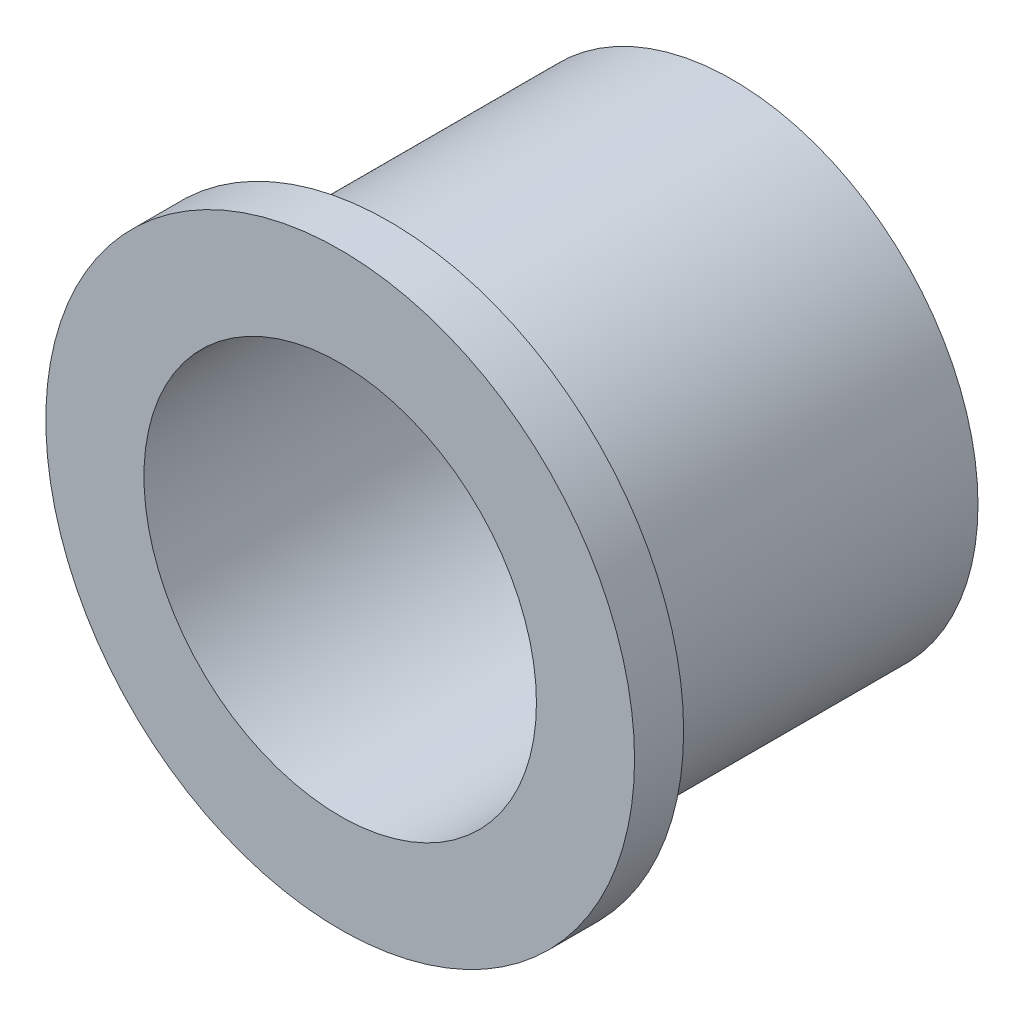
ISO-10303-21;
HEADER;
FILE_DESCRIPTION(('STEP AP214'),'2;1');
FILE_NAME('part.step','',(''),(''),'','','');
FILE_SCHEMA(('AUTOMOTIVE_DESIGN { 1 0 10303 214 1 1 1 1 }'));
ENDSEC;
DATA;
#1=APPLICATION_CONTEXT('core data for automotive mechanical design processes');
#2=APPLICATION_PROTOCOL_DEFINITION('international standard','automotive_design',2000,#1);
#3=PRODUCT_CONTEXT('',#1,'mechanical');
#4=PRODUCT('Part','Part','',(#3));
#5=PRODUCT_RELATED_PRODUCT_CATEGORY('part','',(#4));
#6=PRODUCT_DEFINITION_FORMATION('','',#4);
#7=PRODUCT_DEFINITION_CONTEXT('part definition',#1,'design');
#8=PRODUCT_DEFINITION('design','',#6,#7);
#9=PRODUCT_DEFINITION_SHAPE('','',#8);
#10=(LENGTH_UNIT() NAMED_UNIT(*) SI_UNIT(.MILLI.,.METRE.));
#11=(NAMED_UNIT(*) PLANE_ANGLE_UNIT() SI_UNIT($,.RADIAN.));
#12=(NAMED_UNIT(*) SI_UNIT($,.STERADIAN.) SOLID_ANGLE_UNIT());
#13=UNCERTAINTY_MEASURE_WITH_UNIT(LENGTH_MEASURE(1.E-05),#10,'distance_accuracy_value','');
#14=(GEOMETRIC_REPRESENTATION_CONTEXT(3) GLOBAL_UNCERTAINTY_ASSIGNED_CONTEXT((#13)) GLOBAL_UNIT_ASSIGNED_CONTEXT((#10,
#11,#12)) REPRESENTATION_CONTEXT('',''));
#15=CARTESIAN_POINT('',(0.,0.,0.));
#16=DIRECTION('',(0.,0.,1.));
#17=DIRECTION('',(1.,0.,0.));
#18=AXIS2_PLACEMENT_3D('',#15,#16,#17);
#19=CARTESIAN_POINT('',(0.,0.,0.));
#20=DIRECTION('',(0.,0.,1.));
#21=DIRECTION('',(1.,0.,0.));
#22=AXIS2_PLACEMENT_3D('',#19,#20,#21);
#23=CYLINDRICAL_SURFACE('',#22,9.);
#24=CARTESIAN_POINT('',(0.,0.,0.));
#25=DIRECTION('',(0.,0.,1.));
#26=DIRECTION('',(1.,0.,0.));
#27=AXIS2_PLACEMENT_3D('',#24,#25,#26);
#28=CIRCLE('',#27,9.);
#29=CARTESIAN_POINT('',(9.,0.,0.));
#30=VERTEX_POINT('',#29);
#31=EDGE_CURVE('E10',#30,#30,#28,.T.);
#32=ORIENTED_EDGE('',*,*,#31,.F.);
#33=EDGE_LOOP('',(#32));
#34=FACE_BOUND('',#33,.T.);
#35=CARTESIAN_POINT('',(0.,0.,-1.5));
#36=DIRECTION('',(0.,0.,1.));
#37=DIRECTION('',(1.,0.,0.));
#38=AXIS2_PLACEMENT_3D('',#35,#36,#37);
#39=CIRCLE('',#38,9.);
#40=CARTESIAN_POINT('',(9.,0.,-1.5));
#41=VERTEX_POINT('',#40);
#42=EDGE_CURVE('E56',#41,#41,#39,.T.);
#43=ORIENTED_EDGE('',*,*,#42,.T.);
#44=EDGE_LOOP('',(#43));
#45=FACE_BOUND('',#44,.T.);
#46=ADVANCED_FACE('F40',(#34,#45),#23,.T.);
#47=CARTESIAN_POINT('',(0.,9.,0.));
#48=DIRECTION('',(0.,0.,-1.));
#49=DIRECTION('',(-1.,0.,0.));
#50=AXIS2_PLACEMENT_3D('',#47,#48,#49);
#51=PLANE('',#50);
#52=CARTESIAN_POINT('',(0.,0.,0.));
#53=DIRECTION('',(0.,0.,1.));
#54=DIRECTION('',(1.,0.,0.));
#55=AXIS2_PLACEMENT_3D('',#52,#53,#54);
#56=CIRCLE('',#55,6.);
#57=CARTESIAN_POINT('',(6.,0.,0.));
#58=VERTEX_POINT('',#57);
#59=EDGE_CURVE('E43',#58,#58,#56,.T.);
#60=ORIENTED_EDGE('',*,*,#59,.F.);
#61=EDGE_LOOP('',(#60));
#62=FACE_BOUND('',#61,.T.);
#63=ORIENTED_EDGE('',*,*,#31,.T.);
#64=EDGE_LOOP('',(#63));
#65=FACE_BOUND('',#64,.T.);
#66=ADVANCED_FACE('F84',(#62,#65),#51,.F.);
#67=CARTESIAN_POINT('',(0.,0.,0.));
#68=DIRECTION('',(0.,0.,1.));
#69=DIRECTION('',(1.,0.,0.));
#70=AXIS2_PLACEMENT_3D('',#67,#68,#69);
#71=CYLINDRICAL_SURFACE('',#70,6.);
#72=CARTESIAN_POINT('',(0.,0.,-12.));
#73=DIRECTION('',(0.,0.,1.));
#74=DIRECTION('',(1.,0.,0.));
#75=AXIS2_PLACEMENT_3D('',#72,#73,#74);
#76=CIRCLE('',#75,6.);
#77=CARTESIAN_POINT('',(6.,0.,-12.));
#78=VERTEX_POINT('',#77);
#79=EDGE_CURVE('E50',#78,#78,#76,.T.);
#80=ORIENTED_EDGE('',*,*,#79,.F.);
#81=EDGE_LOOP('',(#80));
#82=FACE_BOUND('',#81,.T.);
#83=ORIENTED_EDGE('',*,*,#59,.T.);
#84=EDGE_LOOP('',(#83));
#85=FACE_BOUND('',#84,.T.);
#86=ADVANCED_FACE('F77',(#82,#85),#71,.F.);
#87=CARTESIAN_POINT('',(0.,6.,-12.));
#88=DIRECTION('',(0.,0.,1.));
#89=DIRECTION('',(1.,0.,0.));
#90=AXIS2_PLACEMENT_3D('',#87,#88,#89);
#91=PLANE('',#90);
#92=CARTESIAN_POINT('',(0.,0.,-12.));
#93=DIRECTION('',(0.,0.,1.));
#94=DIRECTION('',(1.,0.,0.));
#95=AXIS2_PLACEMENT_3D('',#92,#93,#94);
#96=CIRCLE('',#95,7.5);
#97=CARTESIAN_POINT('',(7.5,0.,-12.));
#98=VERTEX_POINT('',#97);
#99=EDGE_CURVE('E51',#98,#98,#96,.T.);
#100=ORIENTED_EDGE('',*,*,#99,.F.);
#101=EDGE_LOOP('',(#100));
#102=FACE_BOUND('',#101,.T.);
#103=ORIENTED_EDGE('',*,*,#79,.T.);
#104=EDGE_LOOP('',(#103));
#105=FACE_BOUND('',#104,.T.);
#106=ADVANCED_FACE('F71',(#102,#105),#91,.F.);
#107=CARTESIAN_POINT('',(0.,0.,0.));
#108=DIRECTION('',(0.,0.,1.));
#109=DIRECTION('',(1.,0.,0.));
#110=AXIS2_PLACEMENT_3D('',#107,#108,#109);
#111=CYLINDRICAL_SURFACE('',#110,7.5);
#112=CARTESIAN_POINT('',(0.,0.,-1.5));
#113=DIRECTION('',(0.,0.,1.));
#114=DIRECTION('',(1.,0.,0.));
#115=AXIS2_PLACEMENT_3D('',#112,#113,#114);
#116=CIRCLE('',#115,7.5);
#117=CARTESIAN_POINT('',(7.5,0.,-1.5));
#118=VERTEX_POINT('',#117);
#119=EDGE_CURVE('E57',#118,#118,#116,.T.);
#120=ORIENTED_EDGE('',*,*,#119,.F.);
#121=EDGE_LOOP('',(#120));
#122=FACE_BOUND('',#121,.T.);
#123=ORIENTED_EDGE('',*,*,#99,.T.);
#124=EDGE_LOOP('',(#123));
#125=FACE_BOUND('',#124,.T.);
#126=ADVANCED_FACE('F70',(#122,#125),#111,.T.);
#127=CARTESIAN_POINT('',(0.,7.5,-1.5));
#128=DIRECTION('',(0.,0.,1.));
#129=DIRECTION('',(1.,0.,0.));
#130=AXIS2_PLACEMENT_3D('',#127,#128,#129);
#131=PLANE('',#130);
#132=ORIENTED_EDGE('',*,*,#42,.F.);
#133=EDGE_LOOP('',(#132));
#134=FACE_BOUND('',#133,.T.);
#135=ORIENTED_EDGE('',*,*,#119,.T.);
#136=EDGE_LOOP('',(#135));
#137=FACE_BOUND('',#136,.T.);
#138=ADVANCED_FACE('F65',(#134,#137),#131,.F.);
#139=CLOSED_SHELL('',(#46,#66,#86,#106,#126,#138));
#140=MANIFOLD_SOLID_BREP('B2',#139);
#141=ADVANCED_BREP_SHAPE_REPRESENTATION('',(#18,#140),#14);
#142=SHAPE_DEFINITION_REPRESENTATION(#9,#141);
ENDSEC;
END-ISO-10303-21;
